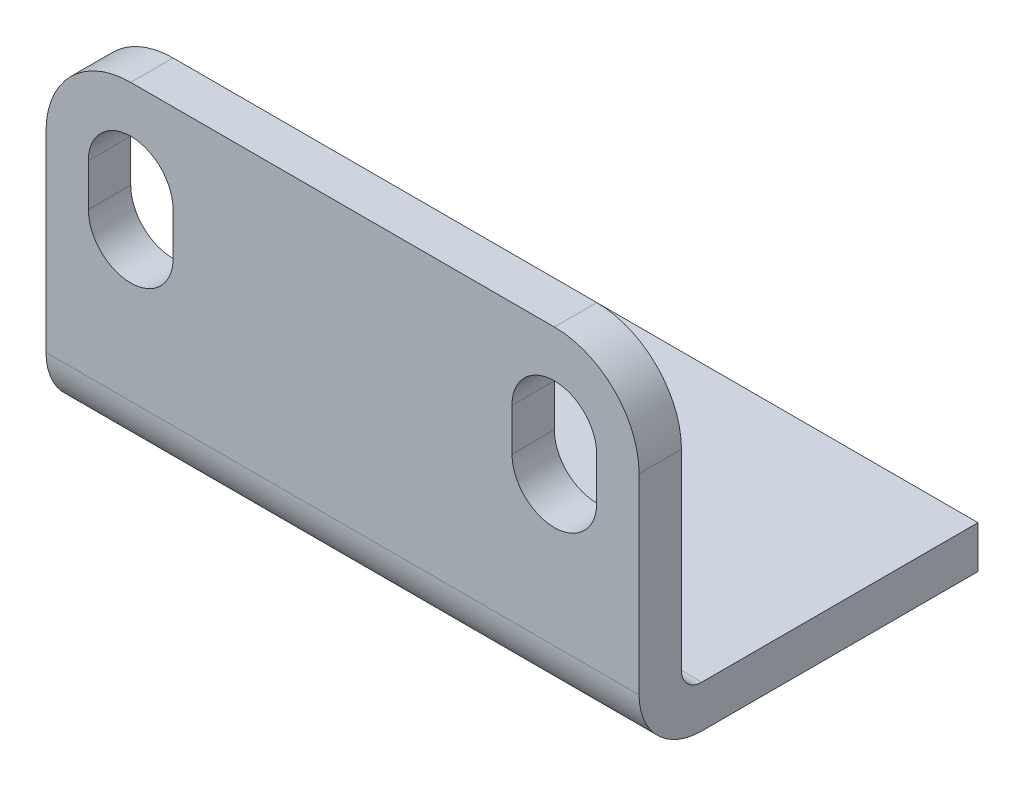
ISO-10303-21;
HEADER;
FILE_DESCRIPTION(('STEP AP214'),'2;1');
FILE_NAME('part.step','',(''),(''),'','','');
FILE_SCHEMA(('AUTOMOTIVE_DESIGN { 1 0 10303 214 1 1 1 1 }'));
ENDSEC;
DATA;
#1=APPLICATION_CONTEXT('core data for automotive mechanical design processes');
#2=APPLICATION_PROTOCOL_DEFINITION('international standard','automotive_design',2000,#1);
#3=PRODUCT_CONTEXT('',#1,'mechanical');
#4=PRODUCT('Part','Part','',(#3));
#5=PRODUCT_RELATED_PRODUCT_CATEGORY('part','',(#4));
#6=PRODUCT_DEFINITION_FORMATION('','',#4);
#7=PRODUCT_DEFINITION_CONTEXT('part definition',#1,'design');
#8=PRODUCT_DEFINITION('design','',#6,#7);
#9=PRODUCT_DEFINITION_SHAPE('','',#8);
#10=(LENGTH_UNIT() NAMED_UNIT(*) SI_UNIT(.MILLI.,.METRE.));
#11=(NAMED_UNIT(*) PLANE_ANGLE_UNIT() SI_UNIT($,.RADIAN.));
#12=(NAMED_UNIT(*) SI_UNIT($,.STERADIAN.) SOLID_ANGLE_UNIT());
#13=UNCERTAINTY_MEASURE_WITH_UNIT(LENGTH_MEASURE(1.E-05),#10,'distance_accuracy_value','');
#14=(GEOMETRIC_REPRESENTATION_CONTEXT(3) GLOBAL_UNCERTAINTY_ASSIGNED_CONTEXT((#13)) GLOBAL_UNIT_ASSIGNED_CONTEXT((#10,
#11,#12)) REPRESENTATION_CONTEXT('',''));
#15=CARTESIAN_POINT('',(0.,0.,0.));
#16=DIRECTION('',(0.,0.,1.));
#17=DIRECTION('',(1.,0.,0.));
#18=AXIS2_PLACEMENT_3D('',#15,#16,#17);
#19=CARTESIAN_POINT('',(-22.225,25.4,0.));
#20=DIRECTION('',(0.,-1.,0.));
#21=DIRECTION('',(0.,0.,-1.));
#22=AXIS2_PLACEMENT_3D('',#19,#20,#21);
#23=PLANE('',#22);
#24=DIRECTION('',(0.,0.,1.));
#25=VECTOR('',#24,1.);
#26=CARTESIAN_POINT('',(15.875,25.4,-4.699));
#27=LINE('',#26,#25);
#28=CARTESIAN_POINT('',(15.875,25.4,-3.175));
#29=VERTEX_POINT('',#28);
#30=CARTESIAN_POINT('',(15.875,25.4,0.));
#31=VERTEX_POINT('',#30);
#32=EDGE_CURVE('E145',#29,#31,#27,.T.);
#33=ORIENTED_EDGE('',*,*,#32,.F.);
#34=DIRECTION('',(1.,0.,0.));
#35=VECTOR('',#34,1.);
#36=CARTESIAN_POINT('',(-22.225,25.4,-3.175));
#37=LINE('',#36,#35);
#38=CARTESIAN_POINT('',(-15.875,25.4,-3.175));
#39=VERTEX_POINT('',#38);
#40=EDGE_CURVE('E231',#29,#39,#37,.F.);
#41=ORIENTED_EDGE('',*,*,#40,.T.);
#42=DIRECTION('',(0.,0.,1.));
#43=VECTOR('',#42,1.);
#44=CARTESIAN_POINT('',(-15.875,25.4,0.));
#45=LINE('',#44,#43);
#46=CARTESIAN_POINT('',(-15.875,25.4,0.));
#47=VERTEX_POINT('',#46);
#48=EDGE_CURVE('E187',#47,#39,#45,.F.);
#49=ORIENTED_EDGE('',*,*,#48,.F.);
#50=DIRECTION('',(1.,0.,0.));
#51=VECTOR('',#50,1.);
#52=CARTESIAN_POINT('',(-22.225,25.4,0.));
#53=LINE('',#52,#51);
#54=EDGE_CURVE('E148',#31,#47,#53,.F.);
#55=ORIENTED_EDGE('',*,*,#54,.F.);
#56=EDGE_LOOP('',(#33,#41,#49,#55));
#57=FACE_BOUND('',#56,.T.);
#58=ADVANCED_FACE('F17',(#57),#23,.F.);
#59=CARTESIAN_POINT('',(-19.05,15.5575,-57.15));
#60=DIRECTION('',(1.,0.,0.));
#61=DIRECTION('',(0.,0.,-1.));
#62=AXIS2_PLACEMENT_3D('',#59,#60,#61);
#63=PLANE('',#62);
#64=DIRECTION('',(0.,1.,0.));
#65=VECTOR('',#64,1.);
#66=CARTESIAN_POINT('',(-19.05,0.,0.));
#67=LINE('',#66,#65);
#68=CARTESIAN_POINT('',(-19.05,15.5575,0.));
#69=VERTEX_POINT('',#68);
#70=CARTESIAN_POINT('',(-19.05,18.7325,0.));
#71=VERTEX_POINT('',#70);
#72=EDGE_CURVE('E245',#69,#71,#67,.T.);
#73=ORIENTED_EDGE('',*,*,#72,.F.);
#74=DIRECTION('',(0.,0.,-1.));
#75=VECTOR('',#74,1.);
#76=CARTESIAN_POINT('',(-19.05,15.5575,-57.15));
#77=LINE('',#76,#75);
#78=CARTESIAN_POINT('',(-19.05,15.5575,-3.175));
#79=VERTEX_POINT('',#78);
#80=EDGE_CURVE('E177',#69,#79,#77,.T.);
#81=ORIENTED_EDGE('',*,*,#80,.T.);
#82=DIRECTION('',(0.,1.,0.));
#83=VECTOR('',#82,1.);
#84=CARTESIAN_POINT('',(-19.05,0.,-3.175));
#85=LINE('',#84,#83);
#86=CARTESIAN_POINT('',(-19.05,18.7325,-3.175));
#87=VERTEX_POINT('',#86);
#88=EDGE_CURVE('E228',#79,#87,#85,.T.);
#89=ORIENTED_EDGE('',*,*,#88,.T.);
#90=DIRECTION('',(0.,0.,-1.));
#91=VECTOR('',#90,1.);
#92=CARTESIAN_POINT('',(-19.05,18.7325,-57.15));
#93=LINE('',#92,#91);
#94=EDGE_CURVE('E184',#87,#71,#93,.F.);
#95=ORIENTED_EDGE('',*,*,#94,.T.);
#96=EDGE_LOOP('',(#73,#81,#89,#95));
#97=FACE_BOUND('',#96,.T.);
#98=ADVANCED_FACE('F519',(#97),#63,.T.);
#99=CARTESIAN_POINT('',(-15.875,18.7325,-57.15));
#100=DIRECTION('',(0.,0.,-1.));
#101=DIRECTION('',(-1.,0.,0.));
#102=AXIS2_PLACEMENT_3D('',#99,#100,#101);
#103=CYLINDRICAL_SURFACE('',#102,3.175);
#104=DIRECTION('',(0.,0.,1.));
#105=VECTOR('',#104,1.);
#106=CARTESIAN_POINT('',(-12.7,18.7325,-57.15));
#107=LINE('',#106,#105);
#108=CARTESIAN_POINT('',(-12.7,18.7325,0.));
#109=VERTEX_POINT('',#108);
#110=CARTESIAN_POINT('',(-12.7,18.7325,-3.175));
#111=VERTEX_POINT('',#110);
#112=EDGE_CURVE('E181',#109,#111,#107,.F.);
#113=ORIENTED_EDGE('',*,*,#112,.F.);
#114=CARTESIAN_POINT('',(-15.875,18.7325,0.));
#115=DIRECTION('',(0.,0.,-1.));
#116=DIRECTION('',(-1.,0.,0.));
#117=AXIS2_PLACEMENT_3D('',#114,#115,#116);
#118=CIRCLE('',#117,3.175);
#119=EDGE_CURVE('E243',#71,#109,#118,.T.);
#120=ORIENTED_EDGE('',*,*,#119,.F.);
#121=ORIENTED_EDGE('',*,*,#94,.F.);
#122=CARTESIAN_POINT('',(-15.875,18.7325,-3.175));
#123=DIRECTION('',(0.,0.,-1.));
#124=DIRECTION('',(-1.,0.,0.));
#125=AXIS2_PLACEMENT_3D('',#122,#123,#124);
#126=CIRCLE('',#125,3.175);
#127=EDGE_CURVE('E226',#87,#111,#126,.T.);
#128=ORIENTED_EDGE('',*,*,#127,.T.);
#129=EDGE_LOOP('',(#113,#120,#121,#128));
#130=FACE_BOUND('',#129,.T.);
#131=ADVANCED_FACE('F510',(#130),#103,.F.);
#132=CARTESIAN_POINT('',(-12.7,18.7325,-57.15));
#133=DIRECTION('',(-1.,0.,0.));
#134=DIRECTION('',(0.,0.,1.));
#135=AXIS2_PLACEMENT_3D('',#132,#133,#134);
#136=PLANE('',#135);
#137=DIRECTION('',(0.,1.,0.));
#138=VECTOR('',#137,1.);
#139=CARTESIAN_POINT('',(-12.7,0.,0.));
#140=LINE('',#139,#138);
#141=CARTESIAN_POINT('',(-12.7,15.5575,0.));
#142=VERTEX_POINT('',#141);
#143=EDGE_CURVE('E248',#109,#142,#140,.F.);
#144=ORIENTED_EDGE('',*,*,#143,.F.);
#145=ORIENTED_EDGE('',*,*,#112,.T.);
#146=DIRECTION('',(0.,1.,0.));
#147=VECTOR('',#146,1.);
#148=CARTESIAN_POINT('',(-12.7,0.,-3.175));
#149=LINE('',#148,#147);
#150=CARTESIAN_POINT('',(-12.7,15.5575,-3.175));
#151=VERTEX_POINT('',#150);
#152=EDGE_CURVE('E225',#111,#151,#149,.F.);
#153=ORIENTED_EDGE('',*,*,#152,.T.);
#154=DIRECTION('',(0.,0.,-1.));
#155=VECTOR('',#154,1.);
#156=CARTESIAN_POINT('',(-12.7,15.5575,-57.15));
#157=LINE('',#156,#155);
#158=EDGE_CURVE('E179',#151,#142,#157,.F.);
#159=ORIENTED_EDGE('',*,*,#158,.T.);
#160=EDGE_LOOP('',(#144,#145,#153,#159));
#161=FACE_BOUND('',#160,.T.);
#162=ADVANCED_FACE('F501',(#161),#136,.T.);
#163=CARTESIAN_POINT('',(-15.875,15.5575,-57.15));
#164=DIRECTION('',(0.,0.,-1.));
#165=DIRECTION('',(-1.,0.,0.));
#166=AXIS2_PLACEMENT_3D('',#163,#164,#165);
#167=CYLINDRICAL_SURFACE('',#166,3.175);
#168=ORIENTED_EDGE('',*,*,#80,.F.);
#169=CARTESIAN_POINT('',(-15.875,15.5575,0.));
#170=DIRECTION('',(0.,0.,-1.));
#171=DIRECTION('',(-1.,0.,0.));
#172=AXIS2_PLACEMENT_3D('',#169,#170,#171);
#173=CIRCLE('',#172,3.175);
#174=EDGE_CURVE('E246',#142,#69,#173,.T.);
#175=ORIENTED_EDGE('',*,*,#174,.F.);
#176=ORIENTED_EDGE('',*,*,#158,.F.);
#177=CARTESIAN_POINT('',(-15.875,15.5575,-3.175));
#178=DIRECTION('',(0.,0.,-1.));
#179=DIRECTION('',(-1.,0.,0.));
#180=AXIS2_PLACEMENT_3D('',#177,#178,#179);
#181=CIRCLE('',#180,3.175);
#182=EDGE_CURVE('E222',#151,#79,#181,.T.);
#183=ORIENTED_EDGE('',*,*,#182,.T.);
#184=EDGE_LOOP('',(#168,#175,#176,#183));
#185=FACE_BOUND('',#184,.T.);
#186=ADVANCED_FACE('F492',(#185),#167,.F.);
#187=CARTESIAN_POINT('',(12.7,15.5575,-57.15));
#188=DIRECTION('',(1.,0.,0.));
#189=DIRECTION('',(0.,0.,-1.));
#190=AXIS2_PLACEMENT_3D('',#187,#188,#189);
#191=PLANE('',#190);
#192=DIRECTION('',(0.,1.,0.));
#193=VECTOR('',#192,1.);
#194=CARTESIAN_POINT('',(12.7,0.,0.));
#195=LINE('',#194,#193);
#196=CARTESIAN_POINT('',(12.7,15.5575,0.));
#197=VERTEX_POINT('',#196);
#198=CARTESIAN_POINT('',(12.7,18.7325,0.));
#199=VERTEX_POINT('',#198);
#200=EDGE_CURVE('E238',#197,#199,#195,.T.);
#201=ORIENTED_EDGE('',*,*,#200,.F.);
#202=DIRECTION('',(0.,0.,-1.));
#203=VECTOR('',#202,1.);
#204=CARTESIAN_POINT('',(12.7,15.5575,-57.15));
#205=LINE('',#204,#203);
#206=CARTESIAN_POINT('',(12.7,15.5575,-3.175));
#207=VERTEX_POINT('',#206);
#208=EDGE_CURVE('E168',#197,#207,#205,.T.);
#209=ORIENTED_EDGE('',*,*,#208,.T.);
#210=DIRECTION('',(0.,1.,0.));
#211=VECTOR('',#210,1.);
#212=CARTESIAN_POINT('',(12.7,0.,-3.175));
#213=LINE('',#212,#211);
#214=CARTESIAN_POINT('',(12.7,18.7325,-3.175));
#215=VERTEX_POINT('',#214);
#216=EDGE_CURVE('E221',#207,#215,#213,.T.);
#217=ORIENTED_EDGE('',*,*,#216,.T.);
#218=DIRECTION('',(0.,0.,-1.));
#219=VECTOR('',#218,1.);
#220=CARTESIAN_POINT('',(12.7,18.7325,-57.15));
#221=LINE('',#220,#219);
#222=EDGE_CURVE('E175',#215,#199,#221,.F.);
#223=ORIENTED_EDGE('',*,*,#222,.T.);
#224=EDGE_LOOP('',(#201,#209,#217,#223));
#225=FACE_BOUND('',#224,.T.);
#226=ADVANCED_FACE('F483',(#225),#191,.T.);
#227=CARTESIAN_POINT('',(15.875,18.7325,-57.15));
#228=DIRECTION('',(0.,0.,-1.));
#229=DIRECTION('',(-1.,0.,0.));
#230=AXIS2_PLACEMENT_3D('',#227,#228,#229);
#231=CYLINDRICAL_SURFACE('',#230,3.175);
#232=DIRECTION('',(0.,0.,1.));
#233=VECTOR('',#232,1.);
#234=CARTESIAN_POINT('',(19.05,18.7325,-57.15));
#235=LINE('',#234,#233);
#236=CARTESIAN_POINT('',(19.05,18.7325,0.));
#237=VERTEX_POINT('',#236);
#238=CARTESIAN_POINT('',(19.05,18.7325,-3.175));
#239=VERTEX_POINT('',#238);
#240=EDGE_CURVE('E172',#237,#239,#235,.F.);
#241=ORIENTED_EDGE('',*,*,#240,.F.);
#242=CARTESIAN_POINT('',(15.875,18.7325,0.));
#243=DIRECTION('',(0.,0.,-1.));
#244=DIRECTION('',(-1.,0.,0.));
#245=AXIS2_PLACEMENT_3D('',#242,#243,#244);
#246=CIRCLE('',#245,3.175);
#247=EDGE_CURVE('E235',#199,#237,#246,.T.);
#248=ORIENTED_EDGE('',*,*,#247,.F.);
#249=ORIENTED_EDGE('',*,*,#222,.F.);
#250=CARTESIAN_POINT('',(15.875,18.7325,-3.175));
#251=DIRECTION('',(0.,0.,-1.));
#252=DIRECTION('',(-1.,0.,0.));
#253=AXIS2_PLACEMENT_3D('',#250,#251,#252);
#254=CIRCLE('',#253,3.175);
#255=EDGE_CURVE('E219',#215,#239,#254,.T.);
#256=ORIENTED_EDGE('',*,*,#255,.T.);
#257=EDGE_LOOP('',(#241,#248,#249,#256));
#258=FACE_BOUND('',#257,.T.);
#259=ADVANCED_FACE('F474',(#258),#231,.F.);
#260=CARTESIAN_POINT('',(19.05,18.7325,-57.15));
#261=DIRECTION('',(-1.,0.,0.));
#262=DIRECTION('',(0.,0.,1.));
#263=AXIS2_PLACEMENT_3D('',#260,#261,#262);
#264=PLANE('',#263);
#265=DIRECTION('',(0.,1.,0.));
#266=VECTOR('',#265,1.);
#267=CARTESIAN_POINT('',(19.05,0.,0.));
#268=LINE('',#267,#266);
#269=CARTESIAN_POINT('',(19.05,15.5575,0.));
#270=VERTEX_POINT('',#269);
#271=EDGE_CURVE('E242',#237,#270,#268,.F.);
#272=ORIENTED_EDGE('',*,*,#271,.F.);
#273=ORIENTED_EDGE('',*,*,#240,.T.);
#274=DIRECTION('',(0.,1.,0.));
#275=VECTOR('',#274,1.);
#276=CARTESIAN_POINT('',(19.05,0.,-3.175));
#277=LINE('',#276,#275);
#278=CARTESIAN_POINT('',(19.05,15.5575,-3.175));
#279=VERTEX_POINT('',#278);
#280=EDGE_CURVE('E218',#239,#279,#277,.F.);
#281=ORIENTED_EDGE('',*,*,#280,.T.);
#282=DIRECTION('',(0.,0.,-1.));
#283=VECTOR('',#282,1.);
#284=CARTESIAN_POINT('',(19.05,15.5575,-57.15));
#285=LINE('',#284,#283);
#286=EDGE_CURVE('E170',#279,#270,#285,.F.);
#287=ORIENTED_EDGE('',*,*,#286,.T.);
#288=EDGE_LOOP('',(#272,#273,#281,#287));
#289=FACE_BOUND('',#288,.T.);
#290=ADVANCED_FACE('F465',(#289),#264,.T.);
#291=CARTESIAN_POINT('',(15.875,15.5575,-57.15));
#292=DIRECTION('',(0.,0.,-1.));
#293=DIRECTION('',(-1.,0.,0.));
#294=AXIS2_PLACEMENT_3D('',#291,#292,#293);
#295=CYLINDRICAL_SURFACE('',#294,3.175);
#296=ORIENTED_EDGE('',*,*,#208,.F.);
#297=CARTESIAN_POINT('',(15.875,15.5575,0.));
#298=DIRECTION('',(0.,0.,-1.));
#299=DIRECTION('',(-1.,0.,0.));
#300=AXIS2_PLACEMENT_3D('',#297,#298,#299);
#301=CIRCLE('',#300,3.175);
#302=EDGE_CURVE('E239',#270,#197,#301,.T.);
#303=ORIENTED_EDGE('',*,*,#302,.F.);
#304=ORIENTED_EDGE('',*,*,#286,.F.);
#305=CARTESIAN_POINT('',(15.875,15.5575,-3.175));
#306=DIRECTION('',(0.,0.,-1.));
#307=DIRECTION('',(-1.,0.,0.));
#308=AXIS2_PLACEMENT_3D('',#305,#306,#307);
#309=CIRCLE('',#308,3.175);
#310=EDGE_CURVE('E214',#279,#207,#309,.T.);
#311=ORIENTED_EDGE('',*,*,#310,.T.);
#312=EDGE_LOOP('',(#296,#303,#304,#311));
#313=FACE_BOUND('',#312,.T.);
#314=ADVANCED_FACE('F457',(#313),#295,.F.);
#315=CARTESIAN_POINT('',(15.875,19.05,-4.699));
#316=DIRECTION('',(0.,0.,1.));
#317=DIRECTION('',(1.,0.,0.));
#318=AXIS2_PLACEMENT_3D('',#315,#316,#317);
#319=CYLINDRICAL_SURFACE('',#318,6.35);
#320=CARTESIAN_POINT('',(15.875,19.05,0.));
#321=DIRECTION('',(0.,0.,1.));
#322=DIRECTION('',(1.,0.,0.));
#323=AXIS2_PLACEMENT_3D('',#320,#321,#322);
#324=CIRCLE('',#323,6.35);
#325=CARTESIAN_POINT('',(22.225,19.05,0.));
#326=VERTEX_POINT('',#325);
#327=EDGE_CURVE('E20',#326,#31,#324,.T.);
#328=ORIENTED_EDGE('',*,*,#327,.F.);
#329=DIRECTION('',(0.,0.,1.));
#330=VECTOR('',#329,1.);
#331=CARTESIAN_POINT('',(22.225,19.05,-4.699));
#332=LINE('',#331,#330);
#333=CARTESIAN_POINT('',(22.225,19.05,-3.175));
#334=VERTEX_POINT('',#333);
#335=EDGE_CURVE('E143',#334,#326,#332,.T.);
#336=ORIENTED_EDGE('',*,*,#335,.F.);
#337=CARTESIAN_POINT('',(15.875,19.05,-3.175));
#338=DIRECTION('',(0.,0.,1.));
#339=DIRECTION('',(1.,0.,0.));
#340=AXIS2_PLACEMENT_3D('',#337,#338,#339);
#341=CIRCLE('',#340,6.35);
#342=EDGE_CURVE('E229',#334,#29,#341,.T.);
#343=ORIENTED_EDGE('',*,*,#342,.T.);
#344=ORIENTED_EDGE('',*,*,#32,.T.);
#345=EDGE_LOOP('',(#328,#336,#343,#344));
#346=FACE_BOUND('',#345,.T.);
#347=ADVANCED_FACE('F140',(#346),#319,.T.);
#348=CARTESIAN_POINT('',(-22.225,0.,0.));
#349=DIRECTION('',(0.,0.,1.));
#350=DIRECTION('',(1.,0.,0.));
#351=AXIS2_PLACEMENT_3D('',#348,#349,#350);
#352=PLANE('',#351);
#353=ORIENTED_EDGE('',*,*,#200,.T.);
#354=ORIENTED_EDGE('',*,*,#247,.T.);
#355=ORIENTED_EDGE('',*,*,#271,.T.);
#356=ORIENTED_EDGE('',*,*,#302,.T.);
#357=EDGE_LOOP('',(#353,#354,#355,#356));
#358=FACE_BOUND('',#357,.T.);
#359=ORIENTED_EDGE('',*,*,#72,.T.);
#360=ORIENTED_EDGE('',*,*,#119,.T.);
#361=ORIENTED_EDGE('',*,*,#143,.T.);
#362=ORIENTED_EDGE('',*,*,#174,.T.);
#363=EDGE_LOOP('',(#359,#360,#361,#362));
#364=FACE_BOUND('',#363,.T.);
#365=DIRECTION('',(0.,1.,0.));
#366=VECTOR('',#365,1.);
#367=CARTESIAN_POINT('',(-22.225,0.,0.));
#368=LINE('',#367,#366);
#369=CARTESIAN_POINT('',(-22.225,4.699,0.));
#370=VERTEX_POINT('',#369);
#371=CARTESIAN_POINT('',(-22.225,19.05,0.));
#372=VERTEX_POINT('',#371);
#373=EDGE_CURVE('E263',#370,#372,#368,.T.);
#374=ORIENTED_EDGE('',*,*,#373,.F.);
#375=DIRECTION('',(-1.,0.,0.));
#376=VECTOR('',#375,1.);
#377=CARTESIAN_POINT('',(-22.225,4.699,0.));
#378=LINE('',#377,#376);
#379=CARTESIAN_POINT('',(22.225,4.699,0.));
#380=VERTEX_POINT('',#379);
#381=EDGE_CURVE('E153',#380,#370,#378,.T.);
#382=ORIENTED_EDGE('',*,*,#381,.F.);
#383=DIRECTION('',(0.,1.,0.));
#384=VECTOR('',#383,1.);
#385=CARTESIAN_POINT('',(22.225,4.699,0.));
#386=LINE('',#385,#384);
#387=EDGE_CURVE('E150',#326,#380,#386,.F.);
#388=ORIENTED_EDGE('',*,*,#387,.F.);
#389=ORIENTED_EDGE('',*,*,#327,.T.);
#390=ORIENTED_EDGE('',*,*,#54,.T.);
#391=CARTESIAN_POINT('',(-15.875,19.05,0.));
#392=DIRECTION('',(0.,0.,1.));
#393=DIRECTION('',(1.,0.,0.));
#394=AXIS2_PLACEMENT_3D('',#391,#392,#393);
#395=CIRCLE('',#394,6.35);
#396=EDGE_CURVE('E189',#372,#47,#395,.F.);
#397=ORIENTED_EDGE('',*,*,#396,.F.);
#398=EDGE_LOOP('',(#374,#382,#388,#389,#390,#397));
#399=FACE_BOUND('',#398,.T.);
#400=ADVANCED_FACE('F151',(#358,#364,#399),#352,.T.);
#401=CARTESIAN_POINT('',(-15.875,19.05,0.));
#402=DIRECTION('',(0.,0.,1.));
#403=DIRECTION('',(1.,0.,0.));
#404=AXIS2_PLACEMENT_3D('',#401,#402,#403);
#405=CYLINDRICAL_SURFACE('',#404,6.35);
#406=ORIENTED_EDGE('',*,*,#396,.T.);
#407=ORIENTED_EDGE('',*,*,#48,.T.);
#408=CARTESIAN_POINT('',(-15.875,19.05,-3.175));
#409=DIRECTION('',(0.,0.,1.));
#410=DIRECTION('',(1.,0.,0.));
#411=AXIS2_PLACEMENT_3D('',#408,#409,#410);
#412=CIRCLE('',#411,6.35);
#413=CARTESIAN_POINT('',(-22.225,19.05,-3.175));
#414=VERTEX_POINT('',#413);
#415=EDGE_CURVE('E188',#39,#414,#412,.T.);
#416=ORIENTED_EDGE('',*,*,#415,.T.);
#417=DIRECTION('',(0.,0.,1.));
#418=VECTOR('',#417,1.);
#419=CARTESIAN_POINT('',(-22.225,19.05,0.));
#420=LINE('',#419,#418);
#421=EDGE_CURVE('E260',#372,#414,#420,.F.);
#422=ORIENTED_EDGE('',*,*,#421,.F.);
#423=EDGE_LOOP('',(#406,#407,#416,#422));
#424=FACE_BOUND('',#423,.T.);
#425=ADVANCED_FACE('F338',(#424),#405,.T.);
#426=CARTESIAN_POINT('',(-22.225,0.,-3.175));
#427=DIRECTION('',(0.,0.,1.));
#428=DIRECTION('',(1.,0.,0.));
#429=AXIS2_PLACEMENT_3D('',#426,#427,#428);
#430=PLANE('',#429);
#431=ORIENTED_EDGE('',*,*,#280,.F.);
#432=ORIENTED_EDGE('',*,*,#255,.F.);
#433=ORIENTED_EDGE('',*,*,#216,.F.);
#434=ORIENTED_EDGE('',*,*,#310,.F.);
#435=EDGE_LOOP('',(#431,#432,#433,#434));
#436=FACE_BOUND('',#435,.T.);
#437=ORIENTED_EDGE('',*,*,#152,.F.);
#438=ORIENTED_EDGE('',*,*,#127,.F.);
#439=ORIENTED_EDGE('',*,*,#88,.F.);
#440=ORIENTED_EDGE('',*,*,#182,.F.);
#441=EDGE_LOOP('',(#437,#438,#439,#440));
#442=FACE_BOUND('',#441,.T.);
#443=ORIENTED_EDGE('',*,*,#342,.F.);
#444=DIRECTION('',(0.,1.,0.));
#445=VECTOR('',#444,1.);
#446=CARTESIAN_POINT('',(22.225,4.699,-3.175));
#447=LINE('',#446,#445);
#448=CARTESIAN_POINT('',(22.225,4.699,-3.175));
#449=VERTEX_POINT('',#448);
#450=EDGE_CURVE('E161',#449,#334,#447,.T.);
#451=ORIENTED_EDGE('',*,*,#450,.F.);
#452=DIRECTION('',(-1.,0.,0.));
#453=VECTOR('',#452,1.);
#454=CARTESIAN_POINT('',(-22.225,4.699,-3.175));
#455=LINE('',#454,#453);
#456=CARTESIAN_POINT('',(-22.225,4.699,-3.175));
#457=VERTEX_POINT('',#456);
#458=EDGE_CURVE('E217',#449,#457,#455,.T.);
#459=ORIENTED_EDGE('',*,*,#458,.T.);
#460=DIRECTION('',(0.,1.,0.));
#461=VECTOR('',#460,1.);
#462=CARTESIAN_POINT('',(-22.225,0.,-3.175));
#463=LINE('',#462,#461);
#464=EDGE_CURVE('E209',#414,#457,#463,.F.);
#465=ORIENTED_EDGE('',*,*,#464,.F.);
#466=ORIENTED_EDGE('',*,*,#415,.F.);
#467=ORIENTED_EDGE('',*,*,#40,.F.);
#468=EDGE_LOOP('',(#443,#451,#459,#465,#466,#467));
#469=FACE_BOUND('',#468,.T.);
#470=ADVANCED_FACE('F331',(#436,#442,#469),#430,.F.);
#471=CARTESIAN_POINT('',(-22.225,4.699,-4.699));
#472=DIRECTION('',(-1.,0.,0.));
#473=DIRECTION('',(0.,0.,1.));
#474=AXIS2_PLACEMENT_3D('',#471,#472,#473);
#475=CYLINDRICAL_SURFACE('',#474,1.524);
#476=DIRECTION('',(1.,0.,0.));
#477=VECTOR('',#476,1.);
#478=CARTESIAN_POINT('',(-22.225,3.175,-4.699));
#479=LINE('',#478,#477);
#480=CARTESIAN_POINT('',(22.225,3.175,-4.699));
#481=VERTEX_POINT('',#480);
#482=CARTESIAN_POINT('',(-22.225,3.175,-4.699));
#483=VERTEX_POINT('',#482);
#484=EDGE_CURVE('E163',#481,#483,#479,.F.);
#485=ORIENTED_EDGE('',*,*,#484,.T.);
#486=CARTESIAN_POINT('',(-22.225,4.699,-4.699));
#487=DIRECTION('',(-1.,0.,0.));
#488=DIRECTION('',(0.,0.,1.));
#489=AXIS2_PLACEMENT_3D('',#486,#487,#488);
#490=CIRCLE('',#489,1.524);
#491=EDGE_CURVE('E206',#457,#483,#490,.F.);
#492=ORIENTED_EDGE('',*,*,#491,.F.);
#493=ORIENTED_EDGE('',*,*,#458,.F.);
#494=CARTESIAN_POINT('',(22.225,4.699,-4.699));
#495=DIRECTION('',(-1.,0.,0.));
#496=DIRECTION('',(0.,0.,1.));
#497=AXIS2_PLACEMENT_3D('',#494,#495,#496);
#498=CIRCLE('',#497,1.524);
#499=EDGE_CURVE('E212',#481,#449,#498,.T.);
#500=ORIENTED_EDGE('',*,*,#499,.F.);
#501=EDGE_LOOP('',(#485,#492,#493,#500));
#502=FACE_BOUND('',#501,.T.);
#503=ADVANCED_FACE('F328',(#502),#475,.F.);
#504=CARTESIAN_POINT('',(-22.225,3.175,0.));
#505=DIRECTION('',(0.,-1.,0.));
#506=DIRECTION('',(0.,0.,-1.));
#507=AXIS2_PLACEMENT_3D('',#504,#505,#506);
#508=PLANE('',#507);
#509=CARTESIAN_POINT('',(9.4488,3.175,-11.1125));
#510=DIRECTION('',(0.,1.,0.));
#511=DIRECTION('',(0.,0.,1.));
#512=AXIS2_PLACEMENT_3D('',#509,#510,#511);
#513=CIRCLE('',#512,2.5146);
#514=CARTESIAN_POINT('',(9.4488,3.175,-8.5979));
#515=VERTEX_POINT('',#514);
#516=EDGE_CURVE('E194',#515,#515,#513,.F.);
#517=ORIENTED_EDGE('',*,*,#516,.T.);
#518=EDGE_LOOP('',(#517));
#519=FACE_BOUND('',#518,.T.);
#520=CARTESIAN_POINT('',(-9.4488,3.175,-11.1125));
#521=DIRECTION('',(0.,1.,0.));
#522=DIRECTION('',(0.,0.,1.));
#523=AXIS2_PLACEMENT_3D('',#520,#521,#522);
#524=CIRCLE('',#523,2.5146);
#525=CARTESIAN_POINT('',(-9.4488,3.175,-8.5979));
#526=VERTEX_POINT('',#525);
#527=EDGE_CURVE('E198',#526,#526,#524,.F.);
#528=ORIENTED_EDGE('',*,*,#527,.T.);
#529=EDGE_LOOP('',(#528));
#530=FACE_BOUND('',#529,.T.);
#531=DIRECTION('',(-1.,0.,0.));
#532=VECTOR('',#531,1.);
#533=CARTESIAN_POINT('',(-22.225,3.175,-25.4));
#534=LINE('',#533,#532);
#535=CARTESIAN_POINT('',(-22.225,3.175,-25.4));
#536=VERTEX_POINT('',#535);
#537=CARTESIAN_POINT('',(22.225,3.175,-25.4));
#538=VERTEX_POINT('',#537);
#539=EDGE_CURVE('E275',#536,#538,#534,.F.);
#540=ORIENTED_EDGE('',*,*,#539,.F.);
#541=DIRECTION('',(0.,0.,1.));
#542=VECTOR('',#541,1.);
#543=CARTESIAN_POINT('',(-22.225,3.175,0.));
#544=LINE('',#543,#542);
#545=EDGE_CURVE('E205',#483,#536,#544,.F.);
#546=ORIENTED_EDGE('',*,*,#545,.F.);
#547=ORIENTED_EDGE('',*,*,#484,.F.);
#548=DIRECTION('',(0.,0.,1.));
#549=VECTOR('',#548,1.);
#550=CARTESIAN_POINT('',(22.225,3.175,-4.699));
#551=LINE('',#550,#549);
#552=EDGE_CURVE('E156',#538,#481,#551,.T.);
#553=ORIENTED_EDGE('',*,*,#552,.F.);
#554=EDGE_LOOP('',(#540,#546,#547,#553));
#555=FACE_BOUND('',#554,.T.);
#556=ADVANCED_FACE('F315',(#519,#530,#555),#508,.F.);
#557=CARTESIAN_POINT('',(22.225,4.699,-4.699));
#558=DIRECTION('',(1.,0.,0.));
#559=DIRECTION('',(0.,1.,0.));
#560=AXIS2_PLACEMENT_3D('',#557,#558,#559);
#561=PLANE('',#560);
#562=ORIENTED_EDGE('',*,*,#552,.T.);
#563=ORIENTED_EDGE('',*,*,#499,.T.);
#564=ORIENTED_EDGE('',*,*,#450,.T.);
#565=ORIENTED_EDGE('',*,*,#335,.T.);
#566=ORIENTED_EDGE('',*,*,#387,.T.);
#567=CARTESIAN_POINT('',(22.225,4.699,-4.699));
#568=DIRECTION('',(-1.,0.,0.));
#569=DIRECTION('',(0.,0.,1.));
#570=AXIS2_PLACEMENT_3D('',#567,#568,#569);
#571=CIRCLE('',#570,4.699);
#572=CARTESIAN_POINT('',(22.225,0.,-4.699));
#573=VERTEX_POINT('',#572);
#574=EDGE_CURVE('E210',#573,#380,#571,.T.);
#575=ORIENTED_EDGE('',*,*,#574,.F.);
#576=DIRECTION('',(0.,0.,-1.));
#577=VECTOR('',#576,1.);
#578=CARTESIAN_POINT('',(22.225,0.,0.));
#579=LINE('',#578,#577);
#580=CARTESIAN_POINT('',(22.225,0.,-25.4));
#581=VERTEX_POINT('',#580);
#582=EDGE_CURVE('E197',#581,#573,#579,.F.);
#583=ORIENTED_EDGE('',*,*,#582,.F.);
#584=DIRECTION('',(0.,1.,0.));
#585=VECTOR('',#584,1.);
#586=CARTESIAN_POINT('',(22.225,0.,-25.4));
#587=LINE('',#586,#585);
#588=EDGE_CURVE('E201',#538,#581,#587,.F.);
#589=ORIENTED_EDGE('',*,*,#588,.F.);
#590=EDGE_LOOP('',(#562,#563,#564,#565,#566,#575,#583,#589));
#591=FACE_BOUND('',#590,.T.);
#592=ADVANCED_FACE('F159',(#591),#561,.T.);
#593=CARTESIAN_POINT('',(-22.225,4.699,-4.699));
#594=DIRECTION('',(-1.,0.,0.));
#595=DIRECTION('',(0.,0.,1.));
#596=AXIS2_PLACEMENT_3D('',#593,#594,#595);
#597=CYLINDRICAL_SURFACE('',#596,4.699);
#598=CARTESIAN_POINT('',(-22.225,4.699,-4.699));
#599=DIRECTION('',(-1.,0.,0.));
#600=DIRECTION('',(0.,0.,1.));
#601=AXIS2_PLACEMENT_3D('',#598,#599,#600);
#602=CIRCLE('',#601,4.699);
#603=CARTESIAN_POINT('',(-22.225,0.,-4.699));
#604=VERTEX_POINT('',#603);
#605=EDGE_CURVE('E202',#604,#370,#602,.T.);
#606=ORIENTED_EDGE('',*,*,#605,.F.);
#607=DIRECTION('',(1.,0.,0.));
#608=VECTOR('',#607,1.);
#609=CARTESIAN_POINT('',(-22.225,0.,-4.699));
#610=LINE('',#609,#608);
#611=EDGE_CURVE('E289',#573,#604,#610,.F.);
#612=ORIENTED_EDGE('',*,*,#611,.F.);
#613=ORIENTED_EDGE('',*,*,#574,.T.);
#614=ORIENTED_EDGE('',*,*,#381,.T.);
#615=EDGE_LOOP('',(#606,#612,#613,#614));
#616=FACE_BOUND('',#615,.T.);
#617=ADVANCED_FACE('F323',(#616),#597,.T.);
#618=CARTESIAN_POINT('',(-22.225,0.,0.));
#619=DIRECTION('',(-1.,0.,0.));
#620=DIRECTION('',(0.,0.,1.));
#621=AXIS2_PLACEMENT_3D('',#618,#619,#620);
#622=PLANE('',#621);
#623=DIRECTION('',(0.,0.,-1.));
#624=VECTOR('',#623,1.);
#625=CARTESIAN_POINT('',(-22.225,0.,0.));
#626=LINE('',#625,#624);
#627=CARTESIAN_POINT('',(-22.225,0.,-25.4));
#628=VERTEX_POINT('',#627);
#629=EDGE_CURVE('E297',#604,#628,#626,.T.);
#630=ORIENTED_EDGE('',*,*,#629,.F.);
#631=ORIENTED_EDGE('',*,*,#605,.T.);
#632=ORIENTED_EDGE('',*,*,#373,.T.);
#633=ORIENTED_EDGE('',*,*,#421,.T.);
#634=ORIENTED_EDGE('',*,*,#464,.T.);
#635=ORIENTED_EDGE('',*,*,#491,.T.);
#636=ORIENTED_EDGE('',*,*,#545,.T.);
#637=DIRECTION('',(0.,1.,0.));
#638=VECTOR('',#637,1.);
#639=CARTESIAN_POINT('',(-22.225,0.,-25.4));
#640=LINE('',#639,#638);
#641=EDGE_CURVE('E35',#628,#536,#640,.T.);
#642=ORIENTED_EDGE('',*,*,#641,.F.);
#643=EDGE_LOOP('',(#630,#631,#632,#633,#634,#635,#636,#642));
#644=FACE_BOUND('',#643,.T.);
#645=ADVANCED_FACE('F312',(#644),#622,.T.);
#646=CARTESIAN_POINT('',(-22.225,0.,-25.4));
#647=DIRECTION('',(0.,0.,-1.));
#648=DIRECTION('',(-1.,0.,0.));
#649=AXIS2_PLACEMENT_3D('',#646,#647,#648);
#650=PLANE('',#649);
#651=ORIENTED_EDGE('',*,*,#588,.T.);
#652=DIRECTION('',(1.,0.,0.));
#653=VECTOR('',#652,1.);
#654=CARTESIAN_POINT('',(-22.225,0.,-25.4));
#655=LINE('',#654,#653);
#656=EDGE_CURVE('E193',#628,#581,#655,.T.);
#657=ORIENTED_EDGE('',*,*,#656,.F.);
#658=ORIENTED_EDGE('',*,*,#641,.T.);
#659=ORIENTED_EDGE('',*,*,#539,.T.);
#660=EDGE_LOOP('',(#651,#657,#658,#659));
#661=FACE_BOUND('',#660,.T.);
#662=ADVANCED_FACE('F318',(#661),#650,.T.);
#663=CARTESIAN_POINT('',(-9.4488,57.15,-11.1125));
#664=DIRECTION('',(0.,1.,0.));
#665=DIRECTION('',(0.,0.,1.));
#666=AXIS2_PLACEMENT_3D('',#663,#664,#665);
#667=CYLINDRICAL_SURFACE('',#666,2.5146);
#668=CARTESIAN_POINT('',(-9.4488,0.,-11.1125));
#669=DIRECTION('',(0.,1.,0.));
#670=DIRECTION('',(0.,0.,1.));
#671=AXIS2_PLACEMENT_3D('',#668,#669,#670);
#672=CIRCLE('',#671,2.5146);
#673=CARTESIAN_POINT('',(-9.4488,0.,-8.5979));
#674=VERTEX_POINT('',#673);
#675=EDGE_CURVE('E26',#674,#674,#672,.T.);
#676=ORIENTED_EDGE('',*,*,#675,.F.);
#677=EDGE_LOOP('',(#676));
#678=FACE_BOUND('',#677,.T.);
#679=ORIENTED_EDGE('',*,*,#527,.F.);
#680=EDGE_LOOP('',(#679));
#681=FACE_BOUND('',#680,.T.);
#682=ADVANCED_FACE('F357',(#678,#681),#667,.F.);
#683=CARTESIAN_POINT('',(9.4488,57.15,-11.1125));
#684=DIRECTION('',(0.,1.,0.));
#685=DIRECTION('',(0.,0.,1.));
#686=AXIS2_PLACEMENT_3D('',#683,#684,#685);
#687=CYLINDRICAL_SURFACE('',#686,2.5146);
#688=CARTESIAN_POINT('',(9.4488,0.,-11.1125));
#689=DIRECTION('',(0.,1.,0.));
#690=DIRECTION('',(0.,0.,1.));
#691=AXIS2_PLACEMENT_3D('',#688,#689,#690);
#692=CIRCLE('',#691,2.5146);
#693=CARTESIAN_POINT('',(9.4488,0.,-8.5979));
#694=VERTEX_POINT('',#693);
#695=EDGE_CURVE('E11',#694,#694,#692,.T.);
#696=ORIENTED_EDGE('',*,*,#695,.F.);
#697=EDGE_LOOP('',(#696));
#698=FACE_BOUND('',#697,.T.);
#699=ORIENTED_EDGE('',*,*,#516,.F.);
#700=EDGE_LOOP('',(#699));
#701=FACE_BOUND('',#700,.T.);
#702=ADVANCED_FACE('F351',(#698,#701),#687,.F.);
#703=CARTESIAN_POINT('',(-22.225,0.,0.));
#704=DIRECTION('',(0.,-1.,0.));
#705=DIRECTION('',(0.,0.,-1.));
#706=AXIS2_PLACEMENT_3D('',#703,#704,#705);
#707=PLANE('',#706);
#708=ORIENTED_EDGE('',*,*,#695,.T.);
#709=EDGE_LOOP('',(#708));
#710=FACE_BOUND('',#709,.T.);
#711=ORIENTED_EDGE('',*,*,#675,.T.);
#712=EDGE_LOOP('',(#711));
#713=FACE_BOUND('',#712,.T.);
#714=ORIENTED_EDGE('',*,*,#629,.T.);
#715=ORIENTED_EDGE('',*,*,#656,.T.);
#716=ORIENTED_EDGE('',*,*,#582,.T.);
#717=ORIENTED_EDGE('',*,*,#611,.T.);
#718=EDGE_LOOP('',(#714,#715,#716,#717));
#719=FACE_BOUND('',#718,.T.);
#720=ADVANCED_FACE('F320',(#710,#713,#719),#707,.T.);
#721=CLOSED_SHELL('',(#58,#98,#131,#162,#186,#226,#259,#290,#314,#347,#400,#425,#470,#503,#556,
#592,#617,#645,#662,#682,#702,#720));
#722=MANIFOLD_SOLID_BREP('B1',#721);
#723=ADVANCED_BREP_SHAPE_REPRESENTATION('',(#18,#722),#14);
#724=SHAPE_DEFINITION_REPRESENTATION(#9,#723);
ENDSEC;
END-ISO-10303-21;
